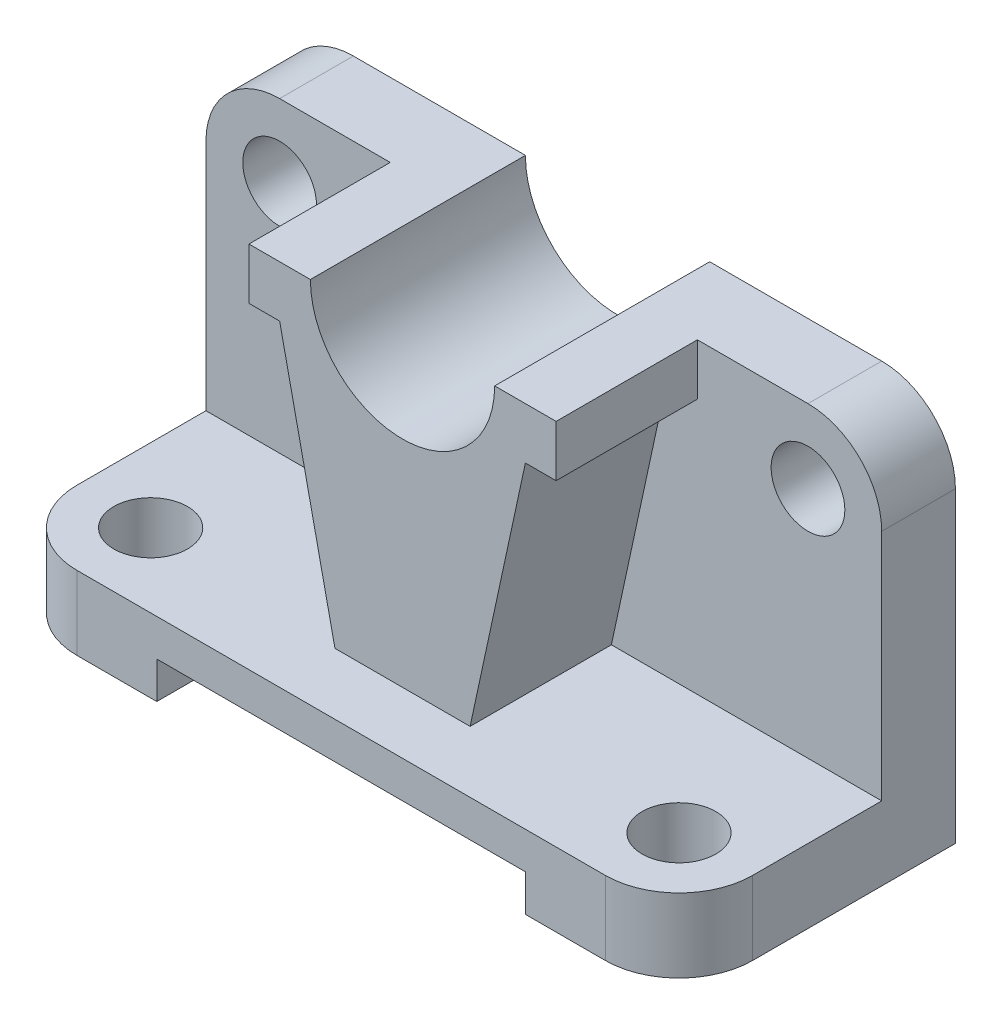
ISO-10303-21;
HEADER;
FILE_DESCRIPTION(('STEP AP214'),'2;1');
FILE_NAME('part.step','',(''),(''),'','','');
FILE_SCHEMA(('AUTOMOTIVE_DESIGN { 1 0 10303 214 1 1 1 1 }'));
ENDSEC;
DATA;
#1=APPLICATION_CONTEXT('core data for automotive mechanical design processes');
#2=APPLICATION_PROTOCOL_DEFINITION('international standard','automotive_design',2000,#1);
#3=PRODUCT_CONTEXT('',#1,'mechanical');
#4=PRODUCT('Part','Part','',(#3));
#5=PRODUCT_RELATED_PRODUCT_CATEGORY('part','',(#4));
#6=PRODUCT_DEFINITION_FORMATION('','',#4);
#7=PRODUCT_DEFINITION_CONTEXT('part definition',#1,'design');
#8=PRODUCT_DEFINITION('design','',#6,#7);
#9=PRODUCT_DEFINITION_SHAPE('','',#8);
#10=(LENGTH_UNIT() NAMED_UNIT(*) SI_UNIT(.MILLI.,.METRE.));
#11=(NAMED_UNIT(*) PLANE_ANGLE_UNIT() SI_UNIT($,.RADIAN.));
#12=(NAMED_UNIT(*) SI_UNIT($,.STERADIAN.) SOLID_ANGLE_UNIT());
#13=UNCERTAINTY_MEASURE_WITH_UNIT(LENGTH_MEASURE(1.E-05),#10,'distance_accuracy_value','');
#14=(GEOMETRIC_REPRESENTATION_CONTEXT(3) GLOBAL_UNCERTAINTY_ASSIGNED_CONTEXT((#13)) GLOBAL_UNIT_ASSIGNED_CONTEXT((#10,
#11,#12)) REPRESENTATION_CONTEXT('',''));
#15=CARTESIAN_POINT('',(0.,0.,0.));
#16=DIRECTION('',(0.,0.,1.));
#17=DIRECTION('',(1.,0.,0.));
#18=AXIS2_PLACEMENT_3D('',#15,#16,#17);
#19=CARTESIAN_POINT('',(0.,62.,12.));
#20=DIRECTION('',(0.,-1.,0.));
#21=DIRECTION('',(0.,0.,-1.));
#22=AXIS2_PLACEMENT_3D('',#19,#20,#21);
#23=PLANE('',#22);
#24=DIRECTION('',(-1.,0.,0.));
#25=VECTOR('',#24,1.);
#26=CARTESIAN_POINT('',(0.,62.,0.));
#27=LINE('',#26,#25);
#28=CARTESIAN_POINT('',(98.,62.,0.));
#29=VERTEX_POINT('',#28);
#30=CARTESIAN_POINT('',(70.,62.,0.));
#31=VERTEX_POINT('',#30);
#32=EDGE_CURVE('E226',#29,#31,#27,.T.);
#33=ORIENTED_EDGE('',*,*,#32,.T.);
#34=DIRECTION('',(0.,0.,1.));
#35=VECTOR('',#34,1.);
#36=CARTESIAN_POINT('',(70.,62.,0.));
#37=LINE('',#36,#35);
#38=CARTESIAN_POINT('',(70.,62.,35.));
#39=VERTEX_POINT('',#38);
#40=EDGE_CURVE('E210',#31,#39,#37,.T.);
#41=ORIENTED_EDGE('',*,*,#40,.T.);
#42=DIRECTION('',(-1.,0.,0.));
#43=VECTOR('',#42,1.);
#44=CARTESIAN_POINT('',(0.,62.,35.));
#45=LINE('',#44,#43);
#46=CARTESIAN_POINT('',(80.,62.,35.));
#47=VERTEX_POINT('',#46);
#48=EDGE_CURVE('E393',#47,#39,#45,.T.);
#49=ORIENTED_EDGE('',*,*,#48,.F.);
#50=DIRECTION('',(0.,0.,-1.));
#51=VECTOR('',#50,1.);
#52=CARTESIAN_POINT('',(80.,62.,35.));
#53=LINE('',#52,#51);
#54=CARTESIAN_POINT('',(80.,62.,12.));
#55=VERTEX_POINT('',#54);
#56=EDGE_CURVE('E446',#47,#55,#53,.T.);
#57=ORIENTED_EDGE('',*,*,#56,.T.);
#58=DIRECTION('',(-1.,0.,0.));
#59=VECTOR('',#58,1.);
#60=CARTESIAN_POINT('',(0.,62.,12.));
#61=LINE('',#60,#59);
#62=CARTESIAN_POINT('',(98.,62.,12.));
#63=VERTEX_POINT('',#62);
#64=EDGE_CURVE('E251',#63,#55,#61,.T.);
#65=ORIENTED_EDGE('',*,*,#64,.F.);
#66=DIRECTION('',(0.,0.,-1.));
#67=VECTOR('',#66,1.);
#68=CARTESIAN_POINT('',(98.,62.,12.));
#69=LINE('',#68,#67);
#70=EDGE_CURVE('E233',#63,#29,#69,.T.);
#71=ORIENTED_EDGE('',*,*,#70,.T.);
#72=EDGE_LOOP('',(#33,#41,#49,#57,#65,#71));
#73=FACE_BOUND('',#72,.T.);
#74=ADVANCED_FACE('F50',(#73),#23,.F.);
#75=CARTESIAN_POINT('',(0.,0.,12.));
#76=DIRECTION('',(0.,1.,0.));
#77=DIRECTION('',(0.,0.,1.));
#78=AXIS2_PLACEMENT_3D('',#75,#76,#77);
#79=PLANE('',#78);
#80=CARTESIAN_POINT('',(12.,0.,33.));
#81=DIRECTION('',(0.,1.,0.));
#82=DIRECTION('',(0.,0.,1.));
#83=AXIS2_PLACEMENT_3D('',#80,#81,#82);
#84=CIRCLE('',#83,6.);
#85=CARTESIAN_POINT('',(12.,0.,39.));
#86=VERTEX_POINT('',#85);
#87=EDGE_CURVE('E568',#86,#86,#84,.T.);
#88=ORIENTED_EDGE('',*,*,#87,.T.);
#89=EDGE_LOOP('',(#88));
#90=FACE_BOUND('',#89,.T.);
#91=DIRECTION('',(1.,0.,0.));
#92=VECTOR('',#91,1.);
#93=CARTESIAN_POINT('',(0.,0.,45.));
#94=LINE('',#93,#92);
#95=CARTESIAN_POINT('',(12.,0.,45.));
#96=VERTEX_POINT('',#95);
#97=CARTESIAN_POINT('',(25.,0.,45.));
#98=VERTEX_POINT('',#97);
#99=EDGE_CURVE('E461',#96,#98,#94,.T.);
#100=ORIENTED_EDGE('',*,*,#99,.F.);
#101=CARTESIAN_POINT('',(12.,0.,33.));
#102=DIRECTION('',(0.,1.,0.));
#103=DIRECTION('',(0.,0.,1.));
#104=AXIS2_PLACEMENT_3D('',#101,#102,#103);
#105=CIRCLE('',#104,12.);
#106=CARTESIAN_POINT('',(0.,0.,33.));
#107=VERTEX_POINT('',#106);
#108=EDGE_CURVE('E263',#96,#107,#105,.F.);
#109=ORIENTED_EDGE('',*,*,#108,.T.);
#110=DIRECTION('',(0.,0.,-1.));
#111=VECTOR('',#110,1.);
#112=CARTESIAN_POINT('',(0.,0.,12.));
#113=LINE('',#112,#111);
#114=CARTESIAN_POINT('',(0.,0.,0.));
#115=VERTEX_POINT('',#114);
#116=EDGE_CURVE('E250',#107,#115,#113,.T.);
#117=ORIENTED_EDGE('',*,*,#116,.T.);
#118=DIRECTION('',(1.,0.,0.));
#119=VECTOR('',#118,1.);
#120=CARTESIAN_POINT('',(0.,0.,0.));
#121=LINE('',#120,#119);
#122=CARTESIAN_POINT('',(25.,0.,0.));
#123=VERTEX_POINT('',#122);
#124=EDGE_CURVE('E326',#115,#123,#121,.T.);
#125=ORIENTED_EDGE('',*,*,#124,.T.);
#126=DIRECTION('',(0.,0.,1.));
#127=VECTOR('',#126,1.);
#128=CARTESIAN_POINT('',(25.,0.,0.));
#129=LINE('',#128,#127);
#130=EDGE_CURVE('E520',#123,#98,#129,.T.);
#131=ORIENTED_EDGE('',*,*,#130,.T.);
#132=EDGE_LOOP('',(#100,#109,#117,#125,#131));
#133=FACE_BOUND('',#132,.T.);
#134=ADVANCED_FACE('F367',(#90,#133),#79,.F.);
#135=CARTESIAN_POINT('',(0.,0.,12.));
#136=DIRECTION('',(0.,0.,-1.));
#137=DIRECTION('',(-1.,0.,0.));
#138=AXIS2_PLACEMENT_3D('',#135,#136,#137);
#139=PLANE('',#138);
#140=CARTESIAN_POINT('',(98.,50.,12.));
#141=DIRECTION('',(0.,0.,1.));
#142=DIRECTION('',(1.,0.,0.));
#143=AXIS2_PLACEMENT_3D('',#140,#141,#142);
#144=CIRCLE('',#143,6.);
#145=CARTESIAN_POINT('',(104.,50.,12.));
#146=VERTEX_POINT('',#145);
#147=EDGE_CURVE('E572',#146,#146,#144,.T.);
#148=ORIENTED_EDGE('',*,*,#147,.F.);
#149=EDGE_LOOP('',(#148));
#150=FACE_BOUND('',#149,.T.);
#151=DIRECTION('',(0.,1.,0.));
#152=VECTOR('',#151,1.);
#153=CARTESIAN_POINT('',(110.,0.,12.));
#154=LINE('',#153,#152);
#155=CARTESIAN_POINT('',(110.,12.,12.));
#156=VERTEX_POINT('',#155);
#157=CARTESIAN_POINT('',(110.,50.,12.));
#158=VERTEX_POINT('',#157);
#159=EDGE_CURVE('E241',#156,#158,#154,.T.);
#160=ORIENTED_EDGE('',*,*,#159,.T.);
#161=CARTESIAN_POINT('',(98.,50.,12.));
#162=DIRECTION('',(0.,0.,-1.));
#163=DIRECTION('',(-1.,0.,0.));
#164=AXIS2_PLACEMENT_3D('',#161,#162,#163);
#165=CIRCLE('',#164,12.);
#166=EDGE_CURVE('E73',#158,#63,#165,.F.);
#167=ORIENTED_EDGE('',*,*,#166,.T.);
#168=ORIENTED_EDGE('',*,*,#64,.T.);
#169=DIRECTION('',(0.,-1.,0.));
#170=VECTOR('',#169,1.);
#171=CARTESIAN_POINT('',(80.,0.,12.));
#172=LINE('',#171,#170);
#173=CARTESIAN_POINT('',(80.,53.6343636869952,12.));
#174=VERTEX_POINT('',#173);
#175=EDGE_CURVE('E421',#55,#174,#172,.T.);
#176=ORIENTED_EDGE('',*,*,#175,.T.);
#177=DIRECTION('',(1.,0.,0.));
#178=VECTOR('',#177,1.);
#179=CARTESIAN_POINT('',(0.,53.6343636869952,12.));
#180=LINE('',#179,#178);
#181=CARTESIAN_POINT('',(75.,53.6343636869952,12.));
#182=VERTEX_POINT('',#181);
#183=EDGE_CURVE('E416',#182,#174,#180,.T.);
#184=ORIENTED_EDGE('',*,*,#183,.F.);
#185=DIRECTION('',(0.211287385230666,0.977423982129755,0.));
#186=VECTOR('',#185,1.);
#187=CARTESIAN_POINT('',(60.5753960062463,-13.0944372815408,12.));
#188=LINE('',#187,#186);
#189=CARTESIAN_POINT('',(66.,12.,12.));
#190=VERTEX_POINT('',#189);
#191=EDGE_CURVE('E413',#190,#182,#188,.T.);
#192=ORIENTED_EDGE('',*,*,#191,.F.);
#193=DIRECTION('',(-1.,0.,0.));
#194=VECTOR('',#193,1.);
#195=CARTESIAN_POINT('',(0.,12.,12.));
#196=LINE('',#195,#194);
#197=EDGE_CURVE('E469',#156,#190,#196,.T.);
#198=ORIENTED_EDGE('',*,*,#197,.F.);
#199=EDGE_LOOP('',(#160,#167,#168,#176,#184,#192,#198));
#200=FACE_BOUND('',#199,.T.);
#201=ADVANCED_FACE('F373',(#150,#200),#139,.F.);
#202=CARTESIAN_POINT('',(12.,50.,12.));
#203=DIRECTION('',(0.,0.,1.));
#204=DIRECTION('',(1.,0.,0.));
#205=AXIS2_PLACEMENT_3D('',#202,#203,#204);
#206=CIRCLE('',#205,6.);
#207=CARTESIAN_POINT('',(18.,50.,12.));
#208=VERTEX_POINT('',#207);
#209=EDGE_CURVE('E580',#208,#208,#206,.T.);
#210=ORIENTED_EDGE('',*,*,#209,.F.);
#211=EDGE_LOOP('',(#210));
#212=FACE_BOUND('',#211,.T.);
#213=CARTESIAN_POINT('',(30.,62.,12.));
#214=VERTEX_POINT('',#213);
#215=CARTESIAN_POINT('',(12.,62.,12.));
#216=VERTEX_POINT('',#215);
#217=EDGE_CURVE('E311',#214,#216,#61,.T.);
#218=ORIENTED_EDGE('',*,*,#217,.T.);
#219=CARTESIAN_POINT('',(12.,50.,12.));
#220=DIRECTION('',(0.,0.,-1.));
#221=DIRECTION('',(-1.,0.,0.));
#222=AXIS2_PLACEMENT_3D('',#219,#220,#221);
#223=CIRCLE('',#222,12.);
#224=CARTESIAN_POINT('',(0.,50.,12.));
#225=VERTEX_POINT('',#224);
#226=EDGE_CURVE('E59',#216,#225,#223,.F.);
#227=ORIENTED_EDGE('',*,*,#226,.T.);
#228=DIRECTION('',(0.,-1.,0.));
#229=VECTOR('',#228,1.);
#230=CARTESIAN_POINT('',(0.,0.,12.));
#231=LINE('',#230,#229);
#232=CARTESIAN_POINT('',(0.,12.,12.));
#233=VERTEX_POINT('',#232);
#234=EDGE_CURVE('E235',#225,#233,#231,.T.);
#235=ORIENTED_EDGE('',*,*,#234,.T.);
#236=CARTESIAN_POINT('',(44.,12.,12.));
#237=VERTEX_POINT('',#236);
#238=EDGE_CURVE('E460',#237,#233,#196,.T.);
#239=ORIENTED_EDGE('',*,*,#238,.F.);
#240=DIRECTION('',(0.211287385230666,-0.977423982129755,0.));
#241=VECTOR('',#240,1.);
#242=CARTESIAN_POINT('',(44.5139444864164,9.62247203751276,12.));
#243=LINE('',#242,#241);
#244=CARTESIAN_POINT('',(35.,53.6343636869952,12.));
#245=VERTEX_POINT('',#244);
#246=EDGE_CURVE('E429',#245,#237,#243,.T.);
#247=ORIENTED_EDGE('',*,*,#246,.F.);
#248=CARTESIAN_POINT('',(30.,53.6343636869952,12.));
#249=VERTEX_POINT('',#248);
#250=EDGE_CURVE('E422',#249,#245,#180,.T.);
#251=ORIENTED_EDGE('',*,*,#250,.F.);
#252=DIRECTION('',(0.,-1.,0.));
#253=VECTOR('',#252,1.);
#254=CARTESIAN_POINT('',(30.,0.,12.));
#255=LINE('',#254,#253);
#256=EDGE_CURVE('E426',#214,#249,#255,.T.);
#257=ORIENTED_EDGE('',*,*,#256,.F.);
#258=EDGE_LOOP('',(#218,#227,#235,#239,#247,#251,#257));
#259=FACE_BOUND('',#258,.T.);
#260=ADVANCED_FACE('F306',(#212,#259),#139,.F.);
#261=CARTESIAN_POINT('',(0.,12.,45.));
#262=DIRECTION('',(0.,-1.,0.));
#263=DIRECTION('',(0.,0.,-1.));
#264=AXIS2_PLACEMENT_3D('',#261,#262,#263);
#265=PLANE('',#264);
#266=CARTESIAN_POINT('',(98.,12.,33.));
#267=DIRECTION('',(0.,1.,0.));
#268=DIRECTION('',(0.,0.,1.));
#269=AXIS2_PLACEMENT_3D('',#266,#267,#268);
#270=CIRCLE('',#269,6.);
#271=CARTESIAN_POINT('',(98.,12.,39.));
#272=VERTEX_POINT('',#271);
#273=EDGE_CURVE('E511',#272,#272,#270,.T.);
#274=ORIENTED_EDGE('',*,*,#273,.F.);
#275=EDGE_LOOP('',(#274));
#276=FACE_BOUND('',#275,.T.);
#277=CARTESIAN_POINT('',(12.,12.,33.));
#278=DIRECTION('',(0.,1.,0.));
#279=DIRECTION('',(0.,0.,1.));
#280=AXIS2_PLACEMENT_3D('',#277,#278,#279);
#281=CIRCLE('',#280,6.);
#282=CARTESIAN_POINT('',(12.,12.,39.));
#283=VERTEX_POINT('',#282);
#284=EDGE_CURVE('E565',#283,#283,#281,.T.);
#285=ORIENTED_EDGE('',*,*,#284,.F.);
#286=EDGE_LOOP('',(#285));
#287=FACE_BOUND('',#286,.T.);
#288=DIRECTION('',(0.,0.,-1.));
#289=VECTOR('',#288,1.);
#290=CARTESIAN_POINT('',(0.,12.,45.));
#291=LINE('',#290,#289);
#292=CARTESIAN_POINT('',(0.,12.,33.));
#293=VERTEX_POINT('',#292);
#294=EDGE_CURVE('E320',#293,#233,#291,.T.);
#295=ORIENTED_EDGE('',*,*,#294,.F.);
#296=CARTESIAN_POINT('',(12.,12.,33.));
#297=DIRECTION('',(0.,-1.,0.));
#298=DIRECTION('',(0.,0.,-1.));
#299=AXIS2_PLACEMENT_3D('',#296,#297,#298);
#300=CIRCLE('',#299,12.);
#301=CARTESIAN_POINT('',(12.,12.,45.));
#302=VERTEX_POINT('',#301);
#303=EDGE_CURVE('E276',#293,#302,#300,.F.);
#304=ORIENTED_EDGE('',*,*,#303,.T.);
#305=DIRECTION('',(-1.,0.,0.));
#306=VECTOR('',#305,1.);
#307=CARTESIAN_POINT('',(0.,12.,45.));
#308=LINE('',#307,#306);
#309=CARTESIAN_POINT('',(98.,12.,45.));
#310=VERTEX_POINT('',#309);
#311=EDGE_CURVE('E464',#310,#302,#308,.T.);
#312=ORIENTED_EDGE('',*,*,#311,.F.);
#313=CARTESIAN_POINT('',(98.,12.,33.));
#314=DIRECTION('',(0.,-1.,0.));
#315=DIRECTION('',(0.,0.,-1.));
#316=AXIS2_PLACEMENT_3D('',#313,#314,#315);
#317=CIRCLE('',#316,12.);
#318=CARTESIAN_POINT('',(110.,12.,33.));
#319=VERTEX_POINT('',#318);
#320=EDGE_CURVE('E273',#310,#319,#317,.F.);
#321=ORIENTED_EDGE('',*,*,#320,.T.);
#322=DIRECTION('',(0.,0.,-1.));
#323=VECTOR('',#322,1.);
#324=CARTESIAN_POINT('',(110.,12.,45.));
#325=LINE('',#324,#323);
#326=EDGE_CURVE('E329',#319,#156,#325,.T.);
#327=ORIENTED_EDGE('',*,*,#326,.T.);
#328=ORIENTED_EDGE('',*,*,#197,.T.);
#329=DIRECTION('',(0.,0.,-1.));
#330=VECTOR('',#329,1.);
#331=CARTESIAN_POINT('',(66.,12.,35.));
#332=LINE('',#331,#330);
#333=CARTESIAN_POINT('',(66.,12.,35.));
#334=VERTEX_POINT('',#333);
#335=EDGE_CURVE('E457',#334,#190,#332,.T.);
#336=ORIENTED_EDGE('',*,*,#335,.F.);
#337=DIRECTION('',(1.,0.,0.));
#338=VECTOR('',#337,1.);
#339=CARTESIAN_POINT('',(0.,12.,35.));
#340=LINE('',#339,#338);
#341=CARTESIAN_POINT('',(44.,12.,35.));
#342=VERTEX_POINT('',#341);
#343=EDGE_CURVE('E432',#342,#334,#340,.T.);
#344=ORIENTED_EDGE('',*,*,#343,.F.);
#345=DIRECTION('',(0.,0.,-1.));
#346=VECTOR('',#345,1.);
#347=CARTESIAN_POINT('',(44.,12.,35.));
#348=LINE('',#347,#346);
#349=EDGE_CURVE('E412',#342,#237,#348,.T.);
#350=ORIENTED_EDGE('',*,*,#349,.T.);
#351=ORIENTED_EDGE('',*,*,#238,.T.);
#352=EDGE_LOOP('',(#295,#304,#312,#321,#327,#328,#336,#344,#350,#351));
#353=FACE_BOUND('',#352,.T.);
#354=ADVANCED_FACE('F493',(#276,#287,#353),#265,.F.);
#355=CARTESIAN_POINT('',(0.,0.,12.));
#356=DIRECTION('',(1.,0.,0.));
#357=DIRECTION('',(0.,0.,-1.));
#358=AXIS2_PLACEMENT_3D('',#355,#356,#357);
#359=PLANE('',#358);
#360=ORIENTED_EDGE('',*,*,#116,.F.);
#361=DIRECTION('',(0.,-1.,0.));
#362=VECTOR('',#361,1.);
#363=CARTESIAN_POINT('',(0.,0.,33.));
#364=LINE('',#363,#362);
#365=EDGE_CURVE('E270',#107,#293,#364,.F.);
#366=ORIENTED_EDGE('',*,*,#365,.T.);
#367=ORIENTED_EDGE('',*,*,#294,.T.);
#368=ORIENTED_EDGE('',*,*,#234,.F.);
#369=DIRECTION('',(0.,0.,-1.));
#370=VECTOR('',#369,1.);
#371=CARTESIAN_POINT('',(0.,50.,12.));
#372=LINE('',#371,#370);
#373=CARTESIAN_POINT('',(0.,50.,0.));
#374=VERTEX_POINT('',#373);
#375=EDGE_CURVE('E266',#225,#374,#372,.T.);
#376=ORIENTED_EDGE('',*,*,#375,.T.);
#377=DIRECTION('',(0.,-1.,0.));
#378=VECTOR('',#377,1.);
#379=CARTESIAN_POINT('',(0.,0.,0.));
#380=LINE('',#379,#378);
#381=EDGE_CURVE('E323',#374,#115,#380,.T.);
#382=ORIENTED_EDGE('',*,*,#381,.T.);
#383=EDGE_LOOP('',(#360,#366,#367,#368,#376,#382));
#384=FACE_BOUND('',#383,.T.);
#385=ADVANCED_FACE('F317',(#384),#359,.F.);
#386=CARTESIAN_POINT('',(98.,0.,33.));
#387=DIRECTION('',(0.,1.,0.));
#388=DIRECTION('',(0.,0.,1.));
#389=AXIS2_PLACEMENT_3D('',#386,#387,#388);
#390=CIRCLE('',#389,6.);
#391=CARTESIAN_POINT('',(98.,0.,39.));
#392=VERTEX_POINT('',#391);
#393=EDGE_CURVE('E562',#392,#392,#390,.T.);
#394=ORIENTED_EDGE('',*,*,#393,.T.);
#395=EDGE_LOOP('',(#394));
#396=FACE_BOUND('',#395,.T.);
#397=DIRECTION('',(0.,0.,-1.));
#398=VECTOR('',#397,1.);
#399=CARTESIAN_POINT('',(110.,0.,12.));
#400=LINE('',#399,#398);
#401=CARTESIAN_POINT('',(110.,0.,33.));
#402=VERTEX_POINT('',#401);
#403=CARTESIAN_POINT('',(110.,0.,0.));
#404=VERTEX_POINT('',#403);
#405=EDGE_CURVE('E248',#402,#404,#400,.T.);
#406=ORIENTED_EDGE('',*,*,#405,.F.);
#407=CARTESIAN_POINT('',(98.,0.,33.));
#408=DIRECTION('',(0.,1.,0.));
#409=DIRECTION('',(0.,0.,1.));
#410=AXIS2_PLACEMENT_3D('',#407,#408,#409);
#411=CIRCLE('',#410,12.);
#412=CARTESIAN_POINT('',(98.,0.,45.));
#413=VERTEX_POINT('',#412);
#414=EDGE_CURVE('E285',#402,#413,#411,.F.);
#415=ORIENTED_EDGE('',*,*,#414,.T.);
#416=CARTESIAN_POINT('',(85.,0.,45.));
#417=VERTEX_POINT('',#416);
#418=EDGE_CURVE('E465',#417,#413,#94,.T.);
#419=ORIENTED_EDGE('',*,*,#418,.F.);
#420=DIRECTION('',(0.,0.,1.));
#421=VECTOR('',#420,1.);
#422=CARTESIAN_POINT('',(85.,0.,0.));
#423=LINE('',#422,#421);
#424=CARTESIAN_POINT('',(85.,0.,0.));
#425=VERTEX_POINT('',#424);
#426=EDGE_CURVE('E523',#425,#417,#423,.T.);
#427=ORIENTED_EDGE('',*,*,#426,.F.);
#428=EDGE_CURVE('E328',#425,#404,#121,.T.);
#429=ORIENTED_EDGE('',*,*,#428,.T.);
#430=EDGE_LOOP('',(#406,#415,#419,#427,#429));
#431=FACE_BOUND('',#430,.T.);
#432=ADVANCED_FACE('F376',(#396,#431),#79,.F.);
#433=CARTESIAN_POINT('',(110.,0.,12.));
#434=DIRECTION('',(-1.,0.,0.));
#435=DIRECTION('',(0.,0.,1.));
#436=AXIS2_PLACEMENT_3D('',#433,#434,#435);
#437=PLANE('',#436);
#438=ORIENTED_EDGE('',*,*,#326,.F.);
#439=DIRECTION('',(0.,1.,0.));
#440=VECTOR('',#439,1.);
#441=CARTESIAN_POINT('',(110.,0.,33.));
#442=LINE('',#441,#440);
#443=EDGE_CURVE('E282',#319,#402,#442,.F.);
#444=ORIENTED_EDGE('',*,*,#443,.T.);
#445=ORIENTED_EDGE('',*,*,#405,.T.);
#446=DIRECTION('',(0.,1.,0.));
#447=VECTOR('',#446,1.);
#448=CARTESIAN_POINT('',(110.,0.,0.));
#449=LINE('',#448,#447);
#450=CARTESIAN_POINT('',(110.,50.,0.));
#451=VERTEX_POINT('',#450);
#452=EDGE_CURVE('E244',#404,#451,#449,.T.);
#453=ORIENTED_EDGE('',*,*,#452,.T.);
#454=DIRECTION('',(0.,0.,-1.));
#455=VECTOR('',#454,1.);
#456=CARTESIAN_POINT('',(110.,50.,12.));
#457=LINE('',#456,#455);
#458=EDGE_CURVE('E279',#451,#158,#457,.F.);
#459=ORIENTED_EDGE('',*,*,#458,.T.);
#460=ORIENTED_EDGE('',*,*,#159,.F.);
#461=EDGE_LOOP('',(#438,#444,#445,#453,#459,#460));
#462=FACE_BOUND('',#461,.T.);
#463=ADVANCED_FACE('F351',(#462),#437,.F.);
#464=CARTESIAN_POINT('',(40.,62.,35.));
#465=VERTEX_POINT('',#464);
#466=CARTESIAN_POINT('',(30.,62.,35.));
#467=VERTEX_POINT('',#466);
#468=EDGE_CURVE('E388',#465,#467,#45,.T.);
#469=ORIENTED_EDGE('',*,*,#468,.F.);
#470=DIRECTION('',(0.,0.,1.));
#471=VECTOR('',#470,1.);
#472=CARTESIAN_POINT('',(40.,62.,0.));
#473=LINE('',#472,#471);
#474=CARTESIAN_POINT('',(40.,62.,0.));
#475=VERTEX_POINT('',#474);
#476=EDGE_CURVE('E65',#465,#475,#473,.F.);
#477=ORIENTED_EDGE('',*,*,#476,.T.);
#478=CARTESIAN_POINT('',(12.,62.,0.));
#479=VERTEX_POINT('',#478);
#480=EDGE_CURVE('E228',#475,#479,#27,.T.);
#481=ORIENTED_EDGE('',*,*,#480,.T.);
#482=DIRECTION('',(0.,0.,-1.));
#483=VECTOR('',#482,1.);
#484=CARTESIAN_POINT('',(12.,62.,12.));
#485=LINE('',#484,#483);
#486=EDGE_CURVE('E288',#479,#216,#485,.F.);
#487=ORIENTED_EDGE('',*,*,#486,.T.);
#488=ORIENTED_EDGE('',*,*,#217,.F.);
#489=DIRECTION('',(0.,0.,-1.));
#490=VECTOR('',#489,1.);
#491=CARTESIAN_POINT('',(30.,62.,35.));
#492=LINE('',#491,#490);
#493=EDGE_CURVE('E389',#467,#214,#492,.T.);
#494=ORIENTED_EDGE('',*,*,#493,.F.);
#495=EDGE_LOOP('',(#469,#477,#481,#487,#488,#494));
#496=FACE_BOUND('',#495,.T.);
#497=ADVANCED_FACE('F369',(#496),#23,.F.);
#498=CARTESIAN_POINT('',(0.,0.,0.));
#499=DIRECTION('',(0.,0.,-1.));
#500=DIRECTION('',(-1.,0.,0.));
#501=AXIS2_PLACEMENT_3D('',#498,#499,#500);
#502=PLANE('',#501);
#503=CARTESIAN_POINT('',(55.,62.,0.));
#504=DIRECTION('',(0.,0.,1.));
#505=DIRECTION('',(1.,0.,0.));
#506=AXIS2_PLACEMENT_3D('',#503,#504,#505);
#507=CIRCLE('',#506,15.);
#508=EDGE_CURVE('E213',#475,#31,#507,.T.);
#509=ORIENTED_EDGE('',*,*,#508,.T.);
#510=ORIENTED_EDGE('',*,*,#32,.F.);
#511=CARTESIAN_POINT('',(98.,50.,0.));
#512=DIRECTION('',(0.,0.,-1.));
#513=DIRECTION('',(-1.,0.,0.));
#514=AXIS2_PLACEMENT_3D('',#511,#512,#513);
#515=CIRCLE('',#514,12.);
#516=EDGE_CURVE('E296',#29,#451,#515,.T.);
#517=ORIENTED_EDGE('',*,*,#516,.T.);
#518=ORIENTED_EDGE('',*,*,#452,.F.);
#519=ORIENTED_EDGE('',*,*,#428,.F.);
#520=DIRECTION('',(0.,1.,0.));
#521=VECTOR('',#520,1.);
#522=CARTESIAN_POINT('',(85.,6.,0.));
#523=LINE('',#522,#521);
#524=CARTESIAN_POINT('',(85.,6.,0.));
#525=VERTEX_POINT('',#524);
#526=EDGE_CURVE('E529',#425,#525,#523,.T.);
#527=ORIENTED_EDGE('',*,*,#526,.T.);
#528=DIRECTION('',(-1.,0.,0.));
#529=VECTOR('',#528,1.);
#530=CARTESIAN_POINT('',(25.,6.,0.));
#531=LINE('',#530,#529);
#532=CARTESIAN_POINT('',(25.,6.,0.));
#533=VERTEX_POINT('',#532);
#534=EDGE_CURVE('E524',#525,#533,#531,.T.);
#535=ORIENTED_EDGE('',*,*,#534,.T.);
#536=DIRECTION('',(0.,-1.,0.));
#537=VECTOR('',#536,1.);
#538=CARTESIAN_POINT('',(25.,6.,0.));
#539=LINE('',#538,#537);
#540=EDGE_CURVE('E526',#533,#123,#539,.T.);
#541=ORIENTED_EDGE('',*,*,#540,.T.);
#542=ORIENTED_EDGE('',*,*,#124,.F.);
#543=ORIENTED_EDGE('',*,*,#381,.F.);
#544=CARTESIAN_POINT('',(12.,50.,0.));
#545=DIRECTION('',(0.,0.,-1.));
#546=DIRECTION('',(-1.,0.,0.));
#547=AXIS2_PLACEMENT_3D('',#544,#545,#546);
#548=CIRCLE('',#547,12.);
#549=EDGE_CURVE('E293',#374,#479,#548,.T.);
#550=ORIENTED_EDGE('',*,*,#549,.T.);
#551=ORIENTED_EDGE('',*,*,#480,.F.);
#552=EDGE_LOOP('',(#509,#510,#517,#518,#519,#527,#535,#541,#542,#543,#550,#551));
#553=FACE_BOUND('',#552,.T.);
#554=CARTESIAN_POINT('',(98.,50.,0.));
#555=DIRECTION('',(0.,0.,1.));
#556=DIRECTION('',(1.,0.,0.));
#557=AXIS2_PLACEMENT_3D('',#554,#555,#556);
#558=CIRCLE('',#557,6.);
#559=CARTESIAN_POINT('',(104.,50.,0.));
#560=VERTEX_POINT('',#559);
#561=EDGE_CURVE('E576',#560,#560,#558,.T.);
#562=ORIENTED_EDGE('',*,*,#561,.T.);
#563=EDGE_LOOP('',(#562));
#564=FACE_BOUND('',#563,.T.);
#565=CARTESIAN_POINT('',(12.,50.,0.));
#566=DIRECTION('',(0.,0.,1.));
#567=DIRECTION('',(1.,0.,0.));
#568=AXIS2_PLACEMENT_3D('',#565,#566,#567);
#569=CIRCLE('',#568,6.);
#570=CARTESIAN_POINT('',(18.,50.,0.));
#571=VERTEX_POINT('',#570);
#572=EDGE_CURVE('E417',#571,#571,#569,.T.);
#573=ORIENTED_EDGE('',*,*,#572,.T.);
#574=EDGE_LOOP('',(#573));
#575=FACE_BOUND('',#574,.T.);
#576=ADVANCED_FACE('F224',(#553,#564,#575),#502,.T.);
#577=CARTESIAN_POINT('',(0.,0.,45.));
#578=DIRECTION('',(0.,0.,-1.));
#579=DIRECTION('',(-1.,0.,0.));
#580=AXIS2_PLACEMENT_3D('',#577,#578,#579);
#581=PLANE('',#580);
#582=ORIENTED_EDGE('',*,*,#311,.T.);
#583=DIRECTION('',(0.,-1.,0.));
#584=VECTOR('',#583,1.);
#585=CARTESIAN_POINT('',(12.,0.,45.));
#586=LINE('',#585,#584);
#587=EDGE_CURVE('E259',#302,#96,#586,.T.);
#588=ORIENTED_EDGE('',*,*,#587,.T.);
#589=ORIENTED_EDGE('',*,*,#99,.T.);
#590=DIRECTION('',(0.,-1.,0.));
#591=VECTOR('',#590,1.);
#592=CARTESIAN_POINT('',(25.,6.,45.));
#593=LINE('',#592,#591);
#594=CARTESIAN_POINT('',(25.,6.,45.));
#595=VERTEX_POINT('',#594);
#596=EDGE_CURVE('E219',#595,#98,#593,.T.);
#597=ORIENTED_EDGE('',*,*,#596,.F.);
#598=DIRECTION('',(-1.,0.,0.));
#599=VECTOR('',#598,1.);
#600=CARTESIAN_POINT('',(25.,6.,45.));
#601=LINE('',#600,#599);
#602=CARTESIAN_POINT('',(85.,6.,45.));
#603=VERTEX_POINT('',#602);
#604=EDGE_CURVE('E530',#603,#595,#601,.T.);
#605=ORIENTED_EDGE('',*,*,#604,.F.);
#606=DIRECTION('',(0.,1.,0.));
#607=VECTOR('',#606,1.);
#608=CARTESIAN_POINT('',(85.,6.,45.));
#609=LINE('',#608,#607);
#610=EDGE_CURVE('E507',#417,#603,#609,.T.);
#611=ORIENTED_EDGE('',*,*,#610,.F.);
#612=ORIENTED_EDGE('',*,*,#418,.T.);
#613=DIRECTION('',(0.,1.,0.));
#614=VECTOR('',#613,1.);
#615=CARTESIAN_POINT('',(98.,0.,45.));
#616=LINE('',#615,#614);
#617=EDGE_CURVE('E255',#413,#310,#616,.T.);
#618=ORIENTED_EDGE('',*,*,#617,.T.);
#619=EDGE_LOOP('',(#582,#588,#589,#597,#605,#611,#612,#618));
#620=FACE_BOUND('',#619,.T.);
#621=ADVANCED_FACE('F385',(#620),#581,.F.);
#622=CARTESIAN_POINT('',(60.5753960062463,-13.0944372815408,35.));
#623=DIRECTION('',(-0.977423982129755,0.211287385230666,0.));
#624=DIRECTION('',(-0.211287385230666,-0.977423982129755,0.));
#625=AXIS2_PLACEMENT_3D('',#622,#623,#624);
#626=PLANE('',#625);
#627=ORIENTED_EDGE('',*,*,#191,.T.);
#628=DIRECTION('',(0.,0.,-1.));
#629=VECTOR('',#628,1.);
#630=CARTESIAN_POINT('',(75.,53.6343636869952,35.));
#631=LINE('',#630,#629);
#632=CARTESIAN_POINT('',(75.,53.6343636869952,35.));
#633=VERTEX_POINT('',#632);
#634=EDGE_CURVE('E453',#633,#182,#631,.T.);
#635=ORIENTED_EDGE('',*,*,#634,.F.);
#636=DIRECTION('',(0.211287385230666,0.977423982129755,0.));
#637=VECTOR('',#636,1.);
#638=CARTESIAN_POINT('',(60.5753960062463,-13.0944372815408,35.));
#639=LINE('',#638,#637);
#640=EDGE_CURVE('E593',#334,#633,#639,.T.);
#641=ORIENTED_EDGE('',*,*,#640,.F.);
#642=ORIENTED_EDGE('',*,*,#335,.T.);
#643=EDGE_LOOP('',(#627,#635,#641,#642));
#644=FACE_BOUND('',#643,.T.);
#645=ADVANCED_FACE('F632',(#644),#626,.F.);
#646=CARTESIAN_POINT('',(0.,53.6343636869952,35.));
#647=DIRECTION('',(0.,1.,0.));
#648=DIRECTION('',(0.,0.,1.));
#649=AXIS2_PLACEMENT_3D('',#646,#647,#648);
#650=PLANE('',#649);
#651=ORIENTED_EDGE('',*,*,#183,.T.);
#652=DIRECTION('',(0.,0.,-1.));
#653=VECTOR('',#652,1.);
#654=CARTESIAN_POINT('',(80.,53.6343636869952,35.));
#655=LINE('',#654,#653);
#656=CARTESIAN_POINT('',(80.,53.6343636869952,35.));
#657=VERTEX_POINT('',#656);
#658=EDGE_CURVE('E450',#657,#174,#655,.T.);
#659=ORIENTED_EDGE('',*,*,#658,.F.);
#660=DIRECTION('',(1.,0.,0.));
#661=VECTOR('',#660,1.);
#662=CARTESIAN_POINT('',(0.,53.6343636869952,35.));
#663=LINE('',#662,#661);
#664=EDGE_CURVE('E401',#633,#657,#663,.T.);
#665=ORIENTED_EDGE('',*,*,#664,.F.);
#666=ORIENTED_EDGE('',*,*,#634,.T.);
#667=EDGE_LOOP('',(#651,#659,#665,#666));
#668=FACE_BOUND('',#667,.T.);
#669=ADVANCED_FACE('F487',(#668),#650,.F.);
#670=CARTESIAN_POINT('',(80.,0.,35.));
#671=DIRECTION('',(1.,0.,0.));
#672=DIRECTION('',(0.,0.,-1.));
#673=AXIS2_PLACEMENT_3D('',#670,#671,#672);
#674=PLANE('',#673);
#675=ORIENTED_EDGE('',*,*,#175,.F.);
#676=ORIENTED_EDGE('',*,*,#56,.F.);
#677=DIRECTION('',(0.,-1.,0.));
#678=VECTOR('',#677,1.);
#679=CARTESIAN_POINT('',(80.,0.,35.));
#680=LINE('',#679,#678);
#681=EDGE_CURVE('E394',#47,#657,#680,.T.);
#682=ORIENTED_EDGE('',*,*,#681,.T.);
#683=ORIENTED_EDGE('',*,*,#658,.T.);
#684=EDGE_LOOP('',(#675,#676,#682,#683));
#685=FACE_BOUND('',#684,.T.);
#686=ADVANCED_FACE('F483',(#685),#674,.T.);
#687=CARTESIAN_POINT('',(30.,0.,35.));
#688=DIRECTION('',(1.,0.,0.));
#689=DIRECTION('',(0.,0.,-1.));
#690=AXIS2_PLACEMENT_3D('',#687,#688,#689);
#691=PLANE('',#690);
#692=ORIENTED_EDGE('',*,*,#256,.T.);
#693=DIRECTION('',(0.,0.,-1.));
#694=VECTOR('',#693,1.);
#695=CARTESIAN_POINT('',(30.,53.6343636869952,35.));
#696=LINE('',#695,#694);
#697=CARTESIAN_POINT('',(30.,53.6343636869952,35.));
#698=VERTEX_POINT('',#697);
#699=EDGE_CURVE('E440',#698,#249,#696,.T.);
#700=ORIENTED_EDGE('',*,*,#699,.F.);
#701=DIRECTION('',(0.,-1.,0.));
#702=VECTOR('',#701,1.);
#703=CARTESIAN_POINT('',(30.,0.,35.));
#704=LINE('',#703,#702);
#705=EDGE_CURVE('E398',#467,#698,#704,.T.);
#706=ORIENTED_EDGE('',*,*,#705,.F.);
#707=ORIENTED_EDGE('',*,*,#493,.T.);
#708=EDGE_LOOP('',(#692,#700,#706,#707));
#709=FACE_BOUND('',#708,.T.);
#710=ADVANCED_FACE('F621',(#709),#691,.F.);
#711=ORIENTED_EDGE('',*,*,#250,.T.);
#712=DIRECTION('',(0.,0.,-1.));
#713=VECTOR('',#712,1.);
#714=CARTESIAN_POINT('',(35.,53.6343636869952,35.));
#715=LINE('',#714,#713);
#716=CARTESIAN_POINT('',(35.,53.6343636869952,35.));
#717=VERTEX_POINT('',#716);
#718=EDGE_CURVE('E436',#717,#245,#715,.T.);
#719=ORIENTED_EDGE('',*,*,#718,.F.);
#720=EDGE_CURVE('E407',#698,#717,#663,.T.);
#721=ORIENTED_EDGE('',*,*,#720,.F.);
#722=ORIENTED_EDGE('',*,*,#699,.T.);
#723=EDGE_LOOP('',(#711,#719,#721,#722));
#724=FACE_BOUND('',#723,.T.);
#725=ADVANCED_FACE('F605',(#724),#650,.F.);
#726=CARTESIAN_POINT('',(44.5139444864164,9.62247203751276,35.));
#727=DIRECTION('',(0.977423982129755,0.211287385230666,0.));
#728=DIRECTION('',(-0.211287385230666,0.977423982129755,0.));
#729=AXIS2_PLACEMENT_3D('',#726,#727,#728);
#730=PLANE('',#729);
#731=ORIENTED_EDGE('',*,*,#246,.T.);
#732=ORIENTED_EDGE('',*,*,#349,.F.);
#733=DIRECTION('',(0.211287385230666,-0.977423982129755,0.));
#734=VECTOR('',#733,1.);
#735=CARTESIAN_POINT('',(44.5139444864164,9.62247203751276,35.));
#736=LINE('',#735,#734);
#737=EDGE_CURVE('E408',#717,#342,#736,.T.);
#738=ORIENTED_EDGE('',*,*,#737,.F.);
#739=ORIENTED_EDGE('',*,*,#718,.T.);
#740=EDGE_LOOP('',(#731,#732,#738,#739));
#741=FACE_BOUND('',#740,.T.);
#742=ADVANCED_FACE('F609',(#741),#730,.F.);
#743=CARTESIAN_POINT('',(0.,0.,35.));
#744=DIRECTION('',(0.,0.,1.));
#745=DIRECTION('',(1.,0.,0.));
#746=AXIS2_PLACEMENT_3D('',#743,#744,#745);
#747=PLANE('',#746);
#748=CARTESIAN_POINT('',(55.,62.,35.));
#749=DIRECTION('',(0.,0.,1.));
#750=DIRECTION('',(1.,0.,0.));
#751=AXIS2_PLACEMENT_3D('',#748,#749,#750);
#752=CIRCLE('',#751,15.);
#753=EDGE_CURVE('E13',#465,#39,#752,.T.);
#754=ORIENTED_EDGE('',*,*,#753,.F.);
#755=ORIENTED_EDGE('',*,*,#468,.T.);
#756=ORIENTED_EDGE('',*,*,#705,.T.);
#757=ORIENTED_EDGE('',*,*,#720,.T.);
#758=ORIENTED_EDGE('',*,*,#737,.T.);
#759=ORIENTED_EDGE('',*,*,#343,.T.);
#760=ORIENTED_EDGE('',*,*,#640,.T.);
#761=ORIENTED_EDGE('',*,*,#664,.T.);
#762=ORIENTED_EDGE('',*,*,#681,.F.);
#763=ORIENTED_EDGE('',*,*,#48,.T.);
#764=EDGE_LOOP('',(#754,#755,#756,#757,#758,#759,#760,#761,#762,#763));
#765=FACE_BOUND('',#764,.T.);
#766=ADVANCED_FACE('F601',(#765),#747,.T.);
#767=CARTESIAN_POINT('',(12.,50.,0.));
#768=DIRECTION('',(0.,0.,1.));
#769=DIRECTION('',(1.,0.,0.));
#770=AXIS2_PLACEMENT_3D('',#767,#768,#769);
#771=CYLINDRICAL_SURFACE('',#770,6.);
#772=ORIENTED_EDGE('',*,*,#572,.F.);
#773=EDGE_LOOP('',(#772));
#774=FACE_BOUND('',#773,.T.);
#775=ORIENTED_EDGE('',*,*,#209,.T.);
#776=EDGE_LOOP('',(#775));
#777=FACE_BOUND('',#776,.T.);
#778=ADVANCED_FACE('F651',(#774,#777),#771,.F.);
#779=CARTESIAN_POINT('',(98.,50.,0.));
#780=DIRECTION('',(0.,0.,1.));
#781=DIRECTION('',(1.,0.,0.));
#782=AXIS2_PLACEMENT_3D('',#779,#780,#781);
#783=CYLINDRICAL_SURFACE('',#782,6.);
#784=ORIENTED_EDGE('',*,*,#561,.F.);
#785=EDGE_LOOP('',(#784));
#786=FACE_BOUND('',#785,.T.);
#787=ORIENTED_EDGE('',*,*,#147,.T.);
#788=EDGE_LOOP('',(#787));
#789=FACE_BOUND('',#788,.T.);
#790=ADVANCED_FACE('F648',(#786,#789),#783,.F.);
#791=CARTESIAN_POINT('',(12.,0.,33.));
#792=DIRECTION('',(0.,1.,0.));
#793=DIRECTION('',(0.,0.,1.));
#794=AXIS2_PLACEMENT_3D('',#791,#792,#793);
#795=CYLINDRICAL_SURFACE('',#794,6.);
#796=ORIENTED_EDGE('',*,*,#87,.F.);
#797=EDGE_LOOP('',(#796));
#798=FACE_BOUND('',#797,.T.);
#799=ORIENTED_EDGE('',*,*,#284,.T.);
#800=EDGE_LOOP('',(#799));
#801=FACE_BOUND('',#800,.T.);
#802=ADVANCED_FACE('F650',(#798,#801),#795,.F.);
#803=CARTESIAN_POINT('',(98.,0.,33.));
#804=DIRECTION('',(0.,1.,0.));
#805=DIRECTION('',(0.,0.,1.));
#806=AXIS2_PLACEMENT_3D('',#803,#804,#805);
#807=CYLINDRICAL_SURFACE('',#806,6.);
#808=ORIENTED_EDGE('',*,*,#393,.F.);
#809=EDGE_LOOP('',(#808));
#810=FACE_BOUND('',#809,.T.);
#811=ORIENTED_EDGE('',*,*,#273,.T.);
#812=EDGE_LOOP('',(#811));
#813=FACE_BOUND('',#812,.T.);
#814=ADVANCED_FACE('F658',(#810,#813),#807,.F.);
#815=CARTESIAN_POINT('',(25.,6.,0.));
#816=DIRECTION('',(-1.,0.,0.));
#817=DIRECTION('',(0.,0.,1.));
#818=AXIS2_PLACEMENT_3D('',#815,#816,#817);
#819=PLANE('',#818);
#820=ORIENTED_EDGE('',*,*,#596,.T.);
#821=ORIENTED_EDGE('',*,*,#130,.F.);
#822=ORIENTED_EDGE('',*,*,#540,.F.);
#823=DIRECTION('',(0.,0.,1.));
#824=VECTOR('',#823,1.);
#825=CARTESIAN_POINT('',(25.,6.,0.));
#826=LINE('',#825,#824);
#827=EDGE_CURVE('E532',#533,#595,#826,.T.);
#828=ORIENTED_EDGE('',*,*,#827,.T.);
#829=EDGE_LOOP('',(#820,#821,#822,#828));
#830=FACE_BOUND('',#829,.T.);
#831=ADVANCED_FACE('F704',(#830),#819,.F.);
#832=CARTESIAN_POINT('',(25.,6.,0.));
#833=DIRECTION('',(0.,1.,0.));
#834=DIRECTION('',(0.,0.,1.));
#835=AXIS2_PLACEMENT_3D('',#832,#833,#834);
#836=PLANE('',#835);
#837=ORIENTED_EDGE('',*,*,#604,.T.);
#838=ORIENTED_EDGE('',*,*,#827,.F.);
#839=ORIENTED_EDGE('',*,*,#534,.F.);
#840=DIRECTION('',(0.,0.,1.));
#841=VECTOR('',#840,1.);
#842=CARTESIAN_POINT('',(85.,6.,0.));
#843=LINE('',#842,#841);
#844=EDGE_CURVE('E535',#525,#603,#843,.T.);
#845=ORIENTED_EDGE('',*,*,#844,.T.);
#846=EDGE_LOOP('',(#837,#838,#839,#845));
#847=FACE_BOUND('',#846,.T.);
#848=ADVANCED_FACE('F715',(#847),#836,.F.);
#849=CARTESIAN_POINT('',(85.,6.,0.));
#850=DIRECTION('',(1.,0.,0.));
#851=DIRECTION('',(0.,0.,-1.));
#852=AXIS2_PLACEMENT_3D('',#849,#850,#851);
#853=PLANE('',#852);
#854=ORIENTED_EDGE('',*,*,#610,.T.);
#855=ORIENTED_EDGE('',*,*,#844,.F.);
#856=ORIENTED_EDGE('',*,*,#526,.F.);
#857=ORIENTED_EDGE('',*,*,#426,.T.);
#858=EDGE_LOOP('',(#854,#855,#856,#857));
#859=FACE_BOUND('',#858,.T.);
#860=ADVANCED_FACE('F727',(#859),#853,.F.);
#861=CARTESIAN_POINT('',(12.,0.,33.));
#862=DIRECTION('',(0.,-1.,0.));
#863=DIRECTION('',(0.,0.,-1.));
#864=AXIS2_PLACEMENT_3D('',#861,#862,#863);
#865=CYLINDRICAL_SURFACE('',#864,12.);
#866=ORIENTED_EDGE('',*,*,#303,.F.);
#867=ORIENTED_EDGE('',*,*,#365,.F.);
#868=ORIENTED_EDGE('',*,*,#108,.F.);
#869=ORIENTED_EDGE('',*,*,#587,.F.);
#870=EDGE_LOOP('',(#866,#867,#868,#869));
#871=FACE_BOUND('',#870,.T.);
#872=ADVANCED_FACE('F363',(#871),#865,.T.);
#873=CARTESIAN_POINT('',(98.,0.,33.));
#874=DIRECTION('',(0.,1.,0.));
#875=DIRECTION('',(0.,0.,1.));
#876=AXIS2_PLACEMENT_3D('',#873,#874,#875);
#877=CYLINDRICAL_SURFACE('',#876,12.);
#878=ORIENTED_EDGE('',*,*,#414,.F.);
#879=ORIENTED_EDGE('',*,*,#443,.F.);
#880=ORIENTED_EDGE('',*,*,#320,.F.);
#881=ORIENTED_EDGE('',*,*,#617,.F.);
#882=EDGE_LOOP('',(#878,#879,#880,#881));
#883=FACE_BOUND('',#882,.T.);
#884=ADVANCED_FACE('F358',(#883),#877,.T.);
#885=CARTESIAN_POINT('',(98.,50.,12.));
#886=DIRECTION('',(0.,0.,-1.));
#887=DIRECTION('',(-1.,0.,0.));
#888=AXIS2_PLACEMENT_3D('',#885,#886,#887);
#889=CYLINDRICAL_SURFACE('',#888,12.);
#890=ORIENTED_EDGE('',*,*,#166,.F.);
#891=ORIENTED_EDGE('',*,*,#458,.F.);
#892=ORIENTED_EDGE('',*,*,#516,.F.);
#893=ORIENTED_EDGE('',*,*,#70,.F.);
#894=EDGE_LOOP('',(#890,#891,#892,#893));
#895=FACE_BOUND('',#894,.T.);
#896=ADVANCED_FACE('F356',(#895),#889,.T.);
#897=CARTESIAN_POINT('',(12.,50.,12.));
#898=DIRECTION('',(0.,0.,-1.));
#899=DIRECTION('',(-1.,0.,0.));
#900=AXIS2_PLACEMENT_3D('',#897,#898,#899);
#901=CYLINDRICAL_SURFACE('',#900,12.);
#902=ORIENTED_EDGE('',*,*,#226,.F.);
#903=ORIENTED_EDGE('',*,*,#486,.F.);
#904=ORIENTED_EDGE('',*,*,#549,.F.);
#905=ORIENTED_EDGE('',*,*,#375,.F.);
#906=EDGE_LOOP('',(#902,#903,#904,#905));
#907=FACE_BOUND('',#906,.T.);
#908=ADVANCED_FACE('F52',(#907),#901,.T.);
#909=CARTESIAN_POINT('',(55.,62.,0.));
#910=DIRECTION('',(0.,0.,1.));
#911=DIRECTION('',(1.,0.,0.));
#912=AXIS2_PLACEMENT_3D('',#909,#910,#911);
#913=CYLINDRICAL_SURFACE('',#912,15.);
#914=ORIENTED_EDGE('',*,*,#508,.F.);
#915=ORIENTED_EDGE('',*,*,#476,.F.);
#916=ORIENTED_EDGE('',*,*,#753,.T.);
#917=ORIENTED_EDGE('',*,*,#40,.F.);
#918=EDGE_LOOP('',(#914,#915,#916,#917));
#919=FACE_BOUND('',#918,.T.);
#920=ADVANCED_FACE('F212',(#919),#913,.F.);
#921=CLOSED_SHELL('',(#74,#134,#201,#260,#354,#385,#432,#463,#497,#576,#621,#645,#669,#686,#710,
#725,#742,#766,#778,#790,#802,#814,#831,#848,#860,#872,#884,#896,#908,#920));
#922=MANIFOLD_SOLID_BREP('B2',#921);
#923=ADVANCED_BREP_SHAPE_REPRESENTATION('',(#18,#922),#14);
#924=SHAPE_DEFINITION_REPRESENTATION(#9,#923);
ENDSEC;
END-ISO-10303-21;
